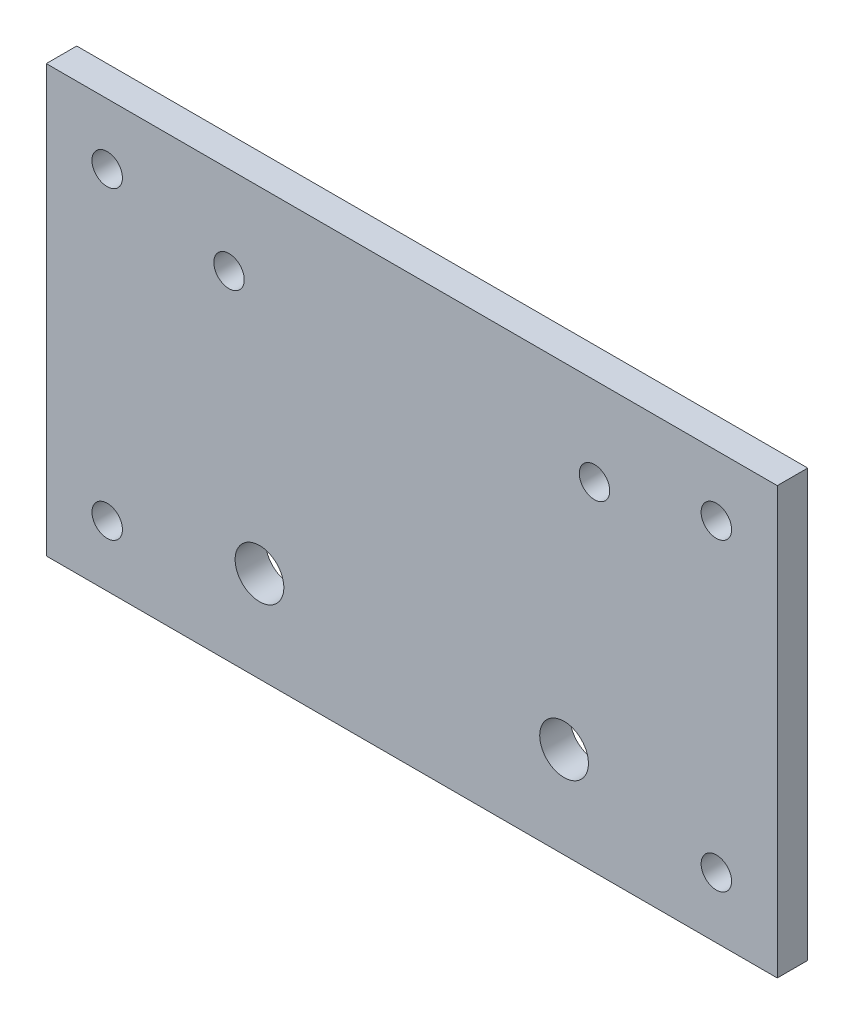
ISO-10303-21;
HEADER;
FILE_DESCRIPTION(('STEP AP214'),'2;1');
FILE_NAME('part.step','',(''),(''),'','','');
FILE_SCHEMA(('AUTOMOTIVE_DESIGN { 1 0 10303 214 1 1 1 1 }'));
ENDSEC;
DATA;
#1=APPLICATION_CONTEXT('core data for automotive mechanical design processes');
#2=APPLICATION_PROTOCOL_DEFINITION('international standard','automotive_design',2000,#1);
#3=PRODUCT_CONTEXT('',#1,'mechanical');
#4=PRODUCT('Part','Part','',(#3));
#5=PRODUCT_RELATED_PRODUCT_CATEGORY('part','',(#4));
#6=PRODUCT_DEFINITION_FORMATION('','',#4);
#7=PRODUCT_DEFINITION_CONTEXT('part definition',#1,'design');
#8=PRODUCT_DEFINITION('design','',#6,#7);
#9=PRODUCT_DEFINITION_SHAPE('','',#8);
#10=(LENGTH_UNIT() NAMED_UNIT(*) SI_UNIT(.MILLI.,.METRE.));
#11=(NAMED_UNIT(*) PLANE_ANGLE_UNIT() SI_UNIT($,.RADIAN.));
#12=(NAMED_UNIT(*) SI_UNIT($,.STERADIAN.) SOLID_ANGLE_UNIT());
#13=UNCERTAINTY_MEASURE_WITH_UNIT(LENGTH_MEASURE(1.E-05),#10,'distance_accuracy_value','');
#14=(GEOMETRIC_REPRESENTATION_CONTEXT(3) GLOBAL_UNCERTAINTY_ASSIGNED_CONTEXT((#13)) GLOBAL_UNIT_ASSIGNED_CONTEXT((#10,
#11,#12)) REPRESENTATION_CONTEXT('',''));
#15=CARTESIAN_POINT('',(0.,0.,0.));
#16=DIRECTION('',(0.,0.,1.));
#17=DIRECTION('',(1.,0.,0.));
#18=AXIS2_PLACEMENT_3D('',#15,#16,#17);
#19=CARTESIAN_POINT('',(0.,0.,5.));
#20=DIRECTION('',(0.,0.,1.));
#21=DIRECTION('',(1.,0.,0.));
#22=AXIS2_PLACEMENT_3D('',#19,#20,#21);
#23=PLANE('',#22);
#24=CARTESIAN_POINT('',(30.,-14.5,5.));
#25=DIRECTION('',(0.,0.,1.));
#26=DIRECTION('',(1.,0.,0.));
#27=AXIS2_PLACEMENT_3D('',#24,#25,#26);
#28=CIRCLE('',#27,2.49999999999999);
#29=CARTESIAN_POINT('',(32.5,-14.5,5.));
#30=VERTEX_POINT('',#29);
#31=EDGE_CURVE('E142',#30,#30,#28,.T.);
#32=ORIENTED_EDGE('',*,*,#31,.F.);
#33=EDGE_LOOP('',(#32));
#34=FACE_BOUND('',#33,.T.);
#35=CARTESIAN_POINT('',(110.,-60.,5.));
#36=DIRECTION('',(0.,0.,1.));
#37=DIRECTION('',(1.,0.,0.));
#38=AXIS2_PLACEMENT_3D('',#35,#36,#37);
#39=CIRCLE('',#38,2.50000000000001);
#40=CARTESIAN_POINT('',(112.5,-60.,5.));
#41=VERTEX_POINT('',#40);
#42=EDGE_CURVE('E130',#41,#41,#39,.T.);
#43=ORIENTED_EDGE('',*,*,#42,.F.);
#44=EDGE_LOOP('',(#43));
#45=FACE_BOUND('',#44,.T.);
#46=CARTESIAN_POINT('',(10.,-10.,5.));
#47=DIRECTION('',(0.,0.,1.));
#48=DIRECTION('',(1.,0.,0.));
#49=AXIS2_PLACEMENT_3D('',#46,#47,#48);
#50=CIRCLE('',#49,2.5);
#51=CARTESIAN_POINT('',(12.5,-10.,5.));
#52=VERTEX_POINT('',#51);
#53=EDGE_CURVE('E118',#52,#52,#50,.T.);
#54=ORIENTED_EDGE('',*,*,#53,.F.);
#55=EDGE_LOOP('',(#54));
#56=FACE_BOUND('',#55,.T.);
#57=CARTESIAN_POINT('',(35.,-55.,5.));
#58=DIRECTION('',(0.,0.,1.));
#59=DIRECTION('',(1.,0.,0.));
#60=AXIS2_PLACEMENT_3D('',#57,#58,#59);
#61=CIRCLE('',#60,4.);
#62=CARTESIAN_POINT('',(39.,-55.,5.));
#63=VERTEX_POINT('',#62);
#64=EDGE_CURVE('E100',#63,#63,#61,.T.);
#65=ORIENTED_EDGE('',*,*,#64,.F.);
#66=EDGE_LOOP('',(#65));
#67=FACE_BOUND('',#66,.T.);
#68=DIRECTION('',(0.,-1.,0.));
#69=VECTOR('',#68,1.);
#70=CARTESIAN_POINT('',(0.,0.,5.));
#71=LINE('',#70,#69);
#72=CARTESIAN_POINT('',(0.,0.,5.));
#73=VERTEX_POINT('',#72);
#74=CARTESIAN_POINT('',(0.,-70.,5.));
#75=VERTEX_POINT('',#74);
#76=EDGE_CURVE('E83',#73,#75,#71,.T.);
#77=ORIENTED_EDGE('',*,*,#76,.T.);
#78=DIRECTION('',(1.,0.,0.));
#79=VECTOR('',#78,1.);
#80=CARTESIAN_POINT('',(0.,-70.,5.));
#81=LINE('',#80,#79);
#82=CARTESIAN_POINT('',(120.,-70.,5.));
#83=VERTEX_POINT('',#82);
#84=EDGE_CURVE('E77',#75,#83,#81,.T.);
#85=ORIENTED_EDGE('',*,*,#84,.T.);
#86=DIRECTION('',(0.,1.,0.));
#87=VECTOR('',#86,1.);
#88=CARTESIAN_POINT('',(120.,0.,5.));
#89=LINE('',#88,#87);
#90=CARTESIAN_POINT('',(120.,0.,5.));
#91=VERTEX_POINT('',#90);
#92=EDGE_CURVE('E80',#83,#91,#89,.T.);
#93=ORIENTED_EDGE('',*,*,#92,.T.);
#94=DIRECTION('',(-1.,0.,0.));
#95=VECTOR('',#94,1.);
#96=CARTESIAN_POINT('',(81.,0.,5.));
#97=LINE('',#96,#95);
#98=EDGE_CURVE('E49',#91,#73,#97,.T.);
#99=ORIENTED_EDGE('',*,*,#98,.T.);
#100=EDGE_LOOP('',(#77,#85,#93,#99));
#101=FACE_BOUND('',#100,.T.);
#102=CARTESIAN_POINT('',(85.,-55.,5.));
#103=DIRECTION('',(0.,0.,1.));
#104=DIRECTION('',(-1.,0.,0.));
#105=AXIS2_PLACEMENT_3D('',#102,#103,#104);
#106=CIRCLE('',#105,4.);
#107=CARTESIAN_POINT('',(81.,-55.,5.));
#108=VERTEX_POINT('',#107);
#109=EDGE_CURVE('E112',#108,#108,#106,.T.);
#110=ORIENTED_EDGE('',*,*,#109,.F.);
#111=EDGE_LOOP('',(#110));
#112=FACE_BOUND('',#111,.T.);
#113=CARTESIAN_POINT('',(110.,-10.,5.));
#114=DIRECTION('',(0.,0.,1.));
#115=DIRECTION('',(-1.,0.,0.));
#116=AXIS2_PLACEMENT_3D('',#113,#114,#115);
#117=CIRCLE('',#116,2.50000000000001);
#118=CARTESIAN_POINT('',(107.5,-10.,5.));
#119=VERTEX_POINT('',#118);
#120=EDGE_CURVE('E124',#119,#119,#117,.T.);
#121=ORIENTED_EDGE('',*,*,#120,.F.);
#122=EDGE_LOOP('',(#121));
#123=FACE_BOUND('',#122,.T.);
#124=CARTESIAN_POINT('',(9.99999999999999,-60.,5.));
#125=DIRECTION('',(0.,0.,1.));
#126=DIRECTION('',(-1.,0.,0.));
#127=AXIS2_PLACEMENT_3D('',#124,#125,#126);
#128=CIRCLE('',#127,2.5);
#129=CARTESIAN_POINT('',(7.49999999999999,-60.,5.));
#130=VERTEX_POINT('',#129);
#131=EDGE_CURVE('E136',#130,#130,#128,.T.);
#132=ORIENTED_EDGE('',*,*,#131,.F.);
#133=EDGE_LOOP('',(#132));
#134=FACE_BOUND('',#133,.T.);
#135=CARTESIAN_POINT('',(90.,-14.5,5.));
#136=DIRECTION('',(0.,0.,1.));
#137=DIRECTION('',(-1.,0.,0.));
#138=AXIS2_PLACEMENT_3D('',#135,#136,#137);
#139=CIRCLE('',#138,2.49999999999999);
#140=CARTESIAN_POINT('',(87.5,-14.5,5.));
#141=VERTEX_POINT('',#140);
#142=EDGE_CURVE('E148',#141,#141,#139,.T.);
#143=ORIENTED_EDGE('',*,*,#142,.F.);
#144=EDGE_LOOP('',(#143));
#145=FACE_BOUND('',#144,.T.);
#146=ADVANCED_FACE('F32',(#34,#45,#56,#67,#101,#112,#123,#134,#145),#23,.T.);
#147=CARTESIAN_POINT('',(0.,0.,0.));
#148=DIRECTION('',(0.,0.,1.));
#149=DIRECTION('',(1.,0.,0.));
#150=AXIS2_PLACEMENT_3D('',#147,#148,#149);
#151=PLANE('',#150);
#152=DIRECTION('',(0.,-1.,0.));
#153=VECTOR('',#152,1.);
#154=CARTESIAN_POINT('',(0.,0.,0.));
#155=LINE('',#154,#153);
#156=CARTESIAN_POINT('',(0.,0.,0.));
#157=VERTEX_POINT('',#156);
#158=CARTESIAN_POINT('',(0.,-70.,0.));
#159=VERTEX_POINT('',#158);
#160=EDGE_CURVE('E97',#157,#159,#155,.T.);
#161=ORIENTED_EDGE('',*,*,#160,.F.);
#162=DIRECTION('',(-1.,0.,0.));
#163=VECTOR('',#162,1.);
#164=CARTESIAN_POINT('',(0.,0.,0.));
#165=LINE('',#164,#163);
#166=CARTESIAN_POINT('',(120.,0.,0.));
#167=VERTEX_POINT('',#166);
#168=EDGE_CURVE('E66',#167,#157,#165,.T.);
#169=ORIENTED_EDGE('',*,*,#168,.F.);
#170=DIRECTION('',(0.,1.,0.));
#171=VECTOR('',#170,1.);
#172=CARTESIAN_POINT('',(120.,0.,0.));
#173=LINE('',#172,#171);
#174=CARTESIAN_POINT('',(120.,-70.,0.));
#175=VERTEX_POINT('',#174);
#176=EDGE_CURVE('E102',#175,#167,#173,.T.);
#177=ORIENTED_EDGE('',*,*,#176,.F.);
#178=DIRECTION('',(1.,0.,0.));
#179=VECTOR('',#178,1.);
#180=CARTESIAN_POINT('',(0.,-70.,0.));
#181=LINE('',#180,#179);
#182=EDGE_CURVE('E88',#159,#175,#181,.T.);
#183=ORIENTED_EDGE('',*,*,#182,.F.);
#184=EDGE_LOOP('',(#161,#169,#177,#183));
#185=FACE_BOUND('',#184,.T.);
#186=CARTESIAN_POINT('',(35.,-55.,0.));
#187=DIRECTION('',(0.,0.,1.));
#188=DIRECTION('',(1.,0.,0.));
#189=AXIS2_PLACEMENT_3D('',#186,#187,#188);
#190=CIRCLE('',#189,4.);
#191=CARTESIAN_POINT('',(39.,-55.,0.));
#192=VERTEX_POINT('',#191);
#193=EDGE_CURVE('E109',#192,#192,#190,.T.);
#194=ORIENTED_EDGE('',*,*,#193,.T.);
#195=EDGE_LOOP('',(#194));
#196=FACE_BOUND('',#195,.T.);
#197=CARTESIAN_POINT('',(85.,-55.,0.));
#198=DIRECTION('',(0.,0.,1.));
#199=DIRECTION('',(-1.,0.,0.));
#200=AXIS2_PLACEMENT_3D('',#197,#198,#199);
#201=CIRCLE('',#200,4.);
#202=CARTESIAN_POINT('',(81.,-55.,0.));
#203=VERTEX_POINT('',#202);
#204=EDGE_CURVE('E115',#203,#203,#201,.T.);
#205=ORIENTED_EDGE('',*,*,#204,.T.);
#206=EDGE_LOOP('',(#205));
#207=FACE_BOUND('',#206,.T.);
#208=CARTESIAN_POINT('',(10.,-10.,0.));
#209=DIRECTION('',(0.,0.,1.));
#210=DIRECTION('',(1.,0.,0.));
#211=AXIS2_PLACEMENT_3D('',#208,#209,#210);
#212=CIRCLE('',#211,2.5);
#213=CARTESIAN_POINT('',(12.5,-10.,0.));
#214=VERTEX_POINT('',#213);
#215=EDGE_CURVE('E121',#214,#214,#212,.T.);
#216=ORIENTED_EDGE('',*,*,#215,.T.);
#217=EDGE_LOOP('',(#216));
#218=FACE_BOUND('',#217,.T.);
#219=CARTESIAN_POINT('',(110.,-10.,0.));
#220=DIRECTION('',(0.,0.,1.));
#221=DIRECTION('',(-1.,0.,0.));
#222=AXIS2_PLACEMENT_3D('',#219,#220,#221);
#223=CIRCLE('',#222,2.50000000000001);
#224=CARTESIAN_POINT('',(107.5,-10.,0.));
#225=VERTEX_POINT('',#224);
#226=EDGE_CURVE('E127',#225,#225,#223,.T.);
#227=ORIENTED_EDGE('',*,*,#226,.T.);
#228=EDGE_LOOP('',(#227));
#229=FACE_BOUND('',#228,.T.);
#230=CARTESIAN_POINT('',(110.,-60.,0.));
#231=DIRECTION('',(0.,0.,1.));
#232=DIRECTION('',(1.,0.,0.));
#233=AXIS2_PLACEMENT_3D('',#230,#231,#232);
#234=CIRCLE('',#233,2.50000000000001);
#235=CARTESIAN_POINT('',(112.5,-60.,0.));
#236=VERTEX_POINT('',#235);
#237=EDGE_CURVE('E133',#236,#236,#234,.T.);
#238=ORIENTED_EDGE('',*,*,#237,.T.);
#239=EDGE_LOOP('',(#238));
#240=FACE_BOUND('',#239,.T.);
#241=CARTESIAN_POINT('',(9.99999999999999,-60.,0.));
#242=DIRECTION('',(0.,0.,1.));
#243=DIRECTION('',(-1.,0.,0.));
#244=AXIS2_PLACEMENT_3D('',#241,#242,#243);
#245=CIRCLE('',#244,2.5);
#246=CARTESIAN_POINT('',(7.49999999999999,-60.,0.));
#247=VERTEX_POINT('',#246);
#248=EDGE_CURVE('E139',#247,#247,#245,.T.);
#249=ORIENTED_EDGE('',*,*,#248,.T.);
#250=EDGE_LOOP('',(#249));
#251=FACE_BOUND('',#250,.T.);
#252=CARTESIAN_POINT('',(30.,-14.5,0.));
#253=DIRECTION('',(0.,0.,1.));
#254=DIRECTION('',(1.,0.,0.));
#255=AXIS2_PLACEMENT_3D('',#252,#253,#254);
#256=CIRCLE('',#255,2.49999999999999);
#257=CARTESIAN_POINT('',(32.5,-14.5,0.));
#258=VERTEX_POINT('',#257);
#259=EDGE_CURVE('E145',#258,#258,#256,.T.);
#260=ORIENTED_EDGE('',*,*,#259,.T.);
#261=EDGE_LOOP('',(#260));
#262=FACE_BOUND('',#261,.T.);
#263=CARTESIAN_POINT('',(90.,-14.5,0.));
#264=DIRECTION('',(0.,0.,1.));
#265=DIRECTION('',(-1.,0.,0.));
#266=AXIS2_PLACEMENT_3D('',#263,#264,#265);
#267=CIRCLE('',#266,2.49999999999999);
#268=CARTESIAN_POINT('',(87.5,-14.5,0.));
#269=VERTEX_POINT('',#268);
#270=EDGE_CURVE('E151',#269,#269,#267,.T.);
#271=ORIENTED_EDGE('',*,*,#270,.T.);
#272=EDGE_LOOP('',(#271));
#273=FACE_BOUND('',#272,.T.);
#274=ADVANCED_FACE('F161',(#185,#196,#207,#218,#229,#240,#251,#262,#273),#151,.F.);
#275=CARTESIAN_POINT('',(0.,0.,5.));
#276=DIRECTION('',(1.,0.,0.));
#277=DIRECTION('',(0.,0.,-1.));
#278=AXIS2_PLACEMENT_3D('',#275,#276,#277);
#279=PLANE('',#278);
#280=ORIENTED_EDGE('',*,*,#160,.T.);
#281=DIRECTION('',(0.,0.,-1.));
#282=VECTOR('',#281,1.);
#283=CARTESIAN_POINT('',(0.,-70.,5.));
#284=LINE('',#283,#282);
#285=EDGE_CURVE('E11',#75,#159,#284,.T.);
#286=ORIENTED_EDGE('',*,*,#285,.F.);
#287=ORIENTED_EDGE('',*,*,#76,.F.);
#288=DIRECTION('',(0.,0.,-1.));
#289=VECTOR('',#288,1.);
#290=CARTESIAN_POINT('',(0.,0.,5.));
#291=LINE('',#290,#289);
#292=EDGE_CURVE('E93',#73,#157,#291,.T.);
#293=ORIENTED_EDGE('',*,*,#292,.T.);
#294=EDGE_LOOP('',(#280,#286,#287,#293));
#295=FACE_BOUND('',#294,.T.);
#296=ADVANCED_FACE('F34',(#295),#279,.F.);
#297=CARTESIAN_POINT('',(0.,-70.,5.));
#298=DIRECTION('',(0.,1.,0.));
#299=DIRECTION('',(0.,0.,1.));
#300=AXIS2_PLACEMENT_3D('',#297,#298,#299);
#301=PLANE('',#300);
#302=ORIENTED_EDGE('',*,*,#182,.T.);
#303=DIRECTION('',(0.,0.,-1.));
#304=VECTOR('',#303,1.);
#305=CARTESIAN_POINT('',(120.,-70.,5.));
#306=LINE('',#305,#304);
#307=EDGE_CURVE('E41',#83,#175,#306,.T.);
#308=ORIENTED_EDGE('',*,*,#307,.F.);
#309=ORIENTED_EDGE('',*,*,#84,.F.);
#310=ORIENTED_EDGE('',*,*,#285,.T.);
#311=EDGE_LOOP('',(#302,#308,#309,#310));
#312=FACE_BOUND('',#311,.T.);
#313=ADVANCED_FACE('F87',(#312),#301,.F.);
#314=CARTESIAN_POINT('',(120.,0.,5.));
#315=DIRECTION('',(-1.,0.,0.));
#316=DIRECTION('',(0.,0.,1.));
#317=AXIS2_PLACEMENT_3D('',#314,#315,#316);
#318=PLANE('',#317);
#319=ORIENTED_EDGE('',*,*,#176,.T.);
#320=DIRECTION('',(0.,0.,-1.));
#321=VECTOR('',#320,1.);
#322=CARTESIAN_POINT('',(120.,0.,5.));
#323=LINE('',#322,#321);
#324=EDGE_CURVE('E90',#91,#167,#323,.T.);
#325=ORIENTED_EDGE('',*,*,#324,.F.);
#326=ORIENTED_EDGE('',*,*,#92,.F.);
#327=ORIENTED_EDGE('',*,*,#307,.T.);
#328=EDGE_LOOP('',(#319,#325,#326,#327));
#329=FACE_BOUND('',#328,.T.);
#330=ADVANCED_FACE('F91',(#329),#318,.F.);
#331=CARTESIAN_POINT('',(0.,0.,5.));
#332=DIRECTION('',(0.,-1.,0.));
#333=DIRECTION('',(1.,0.,0.));
#334=AXIS2_PLACEMENT_3D('',#331,#332,#333);
#335=PLANE('',#334);
#336=ORIENTED_EDGE('',*,*,#168,.T.);
#337=ORIENTED_EDGE('',*,*,#292,.F.);
#338=ORIENTED_EDGE('',*,*,#98,.F.);
#339=ORIENTED_EDGE('',*,*,#324,.T.);
#340=EDGE_LOOP('',(#336,#337,#338,#339));
#341=FACE_BOUND('',#340,.T.);
#342=ADVANCED_FACE('F106',(#341),#335,.F.);
#343=CARTESIAN_POINT('',(35.,-55.,5.));
#344=DIRECTION('',(0.,0.,-1.));
#345=DIRECTION('',(-1.,0.,0.));
#346=AXIS2_PLACEMENT_3D('',#343,#344,#345);
#347=CYLINDRICAL_SURFACE('',#346,4.);
#348=ORIENTED_EDGE('',*,*,#64,.T.);
#349=EDGE_LOOP('',(#348));
#350=FACE_BOUND('',#349,.T.);
#351=ORIENTED_EDGE('',*,*,#193,.F.);
#352=EDGE_LOOP('',(#351));
#353=FACE_BOUND('',#352,.T.);
#354=ADVANCED_FACE('F171',(#350,#353),#347,.F.);
#355=CARTESIAN_POINT('',(85.,-55.,5.));
#356=DIRECTION('',(0.,0.,-1.));
#357=DIRECTION('',(-1.,0.,0.));
#358=AXIS2_PLACEMENT_3D('',#355,#356,#357);
#359=CYLINDRICAL_SURFACE('',#358,4.);
#360=ORIENTED_EDGE('',*,*,#109,.T.);
#361=EDGE_LOOP('',(#360));
#362=FACE_BOUND('',#361,.T.);
#363=ORIENTED_EDGE('',*,*,#204,.F.);
#364=EDGE_LOOP('',(#363));
#365=FACE_BOUND('',#364,.T.);
#366=ADVANCED_FACE('F223',(#362,#365),#359,.F.);
#367=CARTESIAN_POINT('',(10.,-10.,5.));
#368=DIRECTION('',(0.,0.,-1.));
#369=DIRECTION('',(-1.,0.,0.));
#370=AXIS2_PLACEMENT_3D('',#367,#368,#369);
#371=CYLINDRICAL_SURFACE('',#370,2.5);
#372=ORIENTED_EDGE('',*,*,#53,.T.);
#373=EDGE_LOOP('',(#372));
#374=FACE_BOUND('',#373,.T.);
#375=ORIENTED_EDGE('',*,*,#215,.F.);
#376=EDGE_LOOP('',(#375));
#377=FACE_BOUND('',#376,.T.);
#378=ADVANCED_FACE('F231',(#374,#377),#371,.F.);
#379=CARTESIAN_POINT('',(110.,-10.,5.));
#380=DIRECTION('',(0.,0.,-1.));
#381=DIRECTION('',(-1.,0.,0.));
#382=AXIS2_PLACEMENT_3D('',#379,#380,#381);
#383=CYLINDRICAL_SURFACE('',#382,2.50000000000001);
#384=ORIENTED_EDGE('',*,*,#120,.T.);
#385=EDGE_LOOP('',(#384));
#386=FACE_BOUND('',#385,.T.);
#387=ORIENTED_EDGE('',*,*,#226,.F.);
#388=EDGE_LOOP('',(#387));
#389=FACE_BOUND('',#388,.T.);
#390=ADVANCED_FACE('F239',(#386,#389),#383,.F.);
#391=CARTESIAN_POINT('',(110.,-60.,5.));
#392=DIRECTION('',(0.,0.,-1.));
#393=DIRECTION('',(-1.,0.,0.));
#394=AXIS2_PLACEMENT_3D('',#391,#392,#393);
#395=CYLINDRICAL_SURFACE('',#394,2.50000000000001);
#396=ORIENTED_EDGE('',*,*,#42,.T.);
#397=EDGE_LOOP('',(#396));
#398=FACE_BOUND('',#397,.T.);
#399=ORIENTED_EDGE('',*,*,#237,.F.);
#400=EDGE_LOOP('',(#399));
#401=FACE_BOUND('',#400,.T.);
#402=ADVANCED_FACE('F248',(#398,#401),#395,.F.);
#403=CARTESIAN_POINT('',(9.99999999999999,-60.,5.));
#404=DIRECTION('',(0.,0.,-1.));
#405=DIRECTION('',(-1.,0.,0.));
#406=AXIS2_PLACEMENT_3D('',#403,#404,#405);
#407=CYLINDRICAL_SURFACE('',#406,2.5);
#408=ORIENTED_EDGE('',*,*,#131,.T.);
#409=EDGE_LOOP('',(#408));
#410=FACE_BOUND('',#409,.T.);
#411=ORIENTED_EDGE('',*,*,#248,.F.);
#412=EDGE_LOOP('',(#411));
#413=FACE_BOUND('',#412,.T.);
#414=ADVANCED_FACE('F257',(#410,#413),#407,.F.);
#415=CARTESIAN_POINT('',(30.,-14.5,5.));
#416=DIRECTION('',(0.,0.,-1.));
#417=DIRECTION('',(-1.,0.,0.));
#418=AXIS2_PLACEMENT_3D('',#415,#416,#417);
#419=CYLINDRICAL_SURFACE('',#418,2.49999999999999);
#420=ORIENTED_EDGE('',*,*,#31,.T.);
#421=EDGE_LOOP('',(#420));
#422=FACE_BOUND('',#421,.T.);
#423=ORIENTED_EDGE('',*,*,#259,.F.);
#424=EDGE_LOOP('',(#423));
#425=FACE_BOUND('',#424,.T.);
#426=ADVANCED_FACE('F266',(#422,#425),#419,.F.);
#427=CARTESIAN_POINT('',(90.,-14.5,5.));
#428=DIRECTION('',(0.,0.,-1.));
#429=DIRECTION('',(-1.,0.,0.));
#430=AXIS2_PLACEMENT_3D('',#427,#428,#429);
#431=CYLINDRICAL_SURFACE('',#430,2.49999999999999);
#432=ORIENTED_EDGE('',*,*,#142,.T.);
#433=EDGE_LOOP('',(#432));
#434=FACE_BOUND('',#433,.T.);
#435=ORIENTED_EDGE('',*,*,#270,.F.);
#436=EDGE_LOOP('',(#435));
#437=FACE_BOUND('',#436,.T.);
#438=ADVANCED_FACE('F157',(#434,#437),#431,.F.);
#439=CLOSED_SHELL('',(#146,#274,#296,#313,#330,#342,#354,#366,#378,#390,#402,#414,#426,#438));
#440=MANIFOLD_SOLID_BREP('B2',#439);
#441=ADVANCED_BREP_SHAPE_REPRESENTATION('',(#18,#440),#14);
#442=SHAPE_DEFINITION_REPRESENTATION(#9,#441);
ENDSEC;
END-ISO-10303-21;
